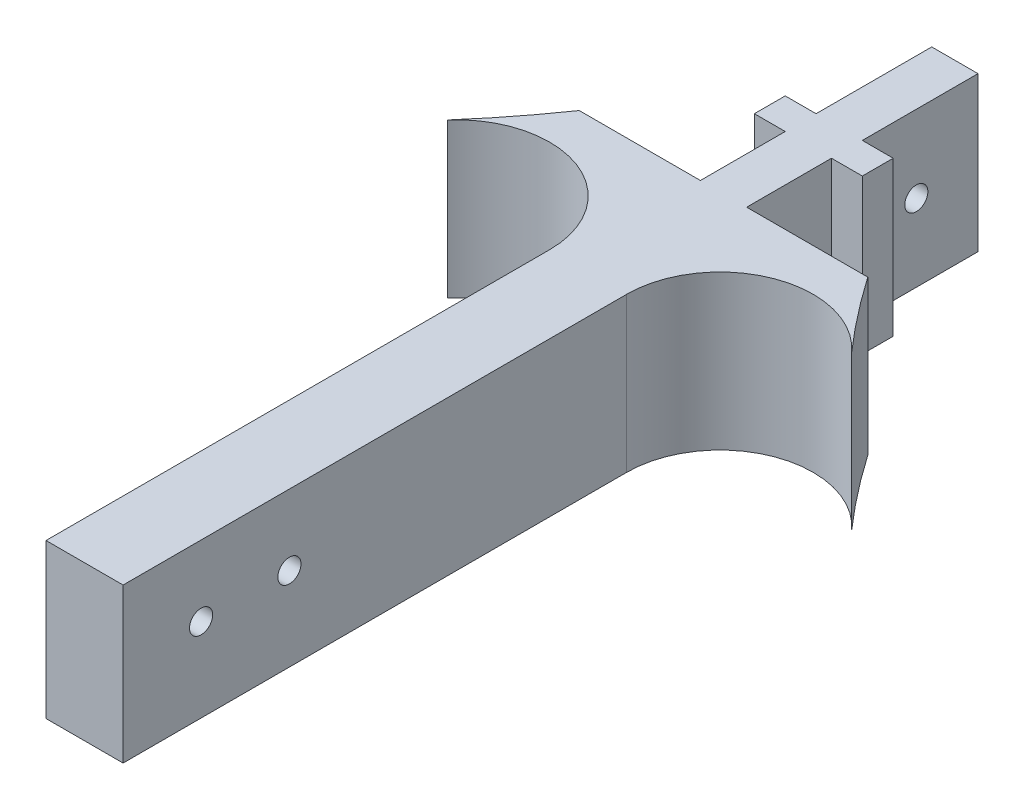
ISO-10303-21;
HEADER;
FILE_DESCRIPTION(('STEP AP214'),'2;1');
FILE_NAME('part.step','',(''),(''),'','','');
FILE_SCHEMA(('AUTOMOTIVE_DESIGN { 1 0 10303 214 1 1 1 1 }'));
ENDSEC;
DATA;
#1=APPLICATION_CONTEXT('core data for automotive mechanical design processes');
#2=APPLICATION_PROTOCOL_DEFINITION('international standard','automotive_design',2000,#1);
#3=PRODUCT_CONTEXT('',#1,'mechanical');
#4=PRODUCT('Part','Part','',(#3));
#5=PRODUCT_RELATED_PRODUCT_CATEGORY('part','',(#4));
#6=PRODUCT_DEFINITION_FORMATION('','',#4);
#7=PRODUCT_DEFINITION_CONTEXT('part definition',#1,'design');
#8=PRODUCT_DEFINITION('design','',#6,#7);
#9=PRODUCT_DEFINITION_SHAPE('','',#8);
#10=(LENGTH_UNIT() NAMED_UNIT(*) SI_UNIT(.MILLI.,.METRE.));
#11=(NAMED_UNIT(*) PLANE_ANGLE_UNIT() SI_UNIT($,.RADIAN.));
#12=(NAMED_UNIT(*) SI_UNIT($,.STERADIAN.) SOLID_ANGLE_UNIT());
#13=UNCERTAINTY_MEASURE_WITH_UNIT(LENGTH_MEASURE(1.E-05),#10,'distance_accuracy_value','');
#14=(GEOMETRIC_REPRESENTATION_CONTEXT(3) GLOBAL_UNCERTAINTY_ASSIGNED_CONTEXT((#13)) GLOBAL_UNIT_ASSIGNED_CONTEXT((#10,
#11,#12)) REPRESENTATION_CONTEXT('',''));
#15=CARTESIAN_POINT('',(0.,0.,0.));
#16=DIRECTION('',(0.,0.,1.));
#17=DIRECTION('',(1.,0.,0.));
#18=AXIS2_PLACEMENT_3D('',#15,#16,#17);
#19=CARTESIAN_POINT('',(-3.,20.,-84.398281038144));
#20=DIRECTION('',(0.,0.,1.));
#21=DIRECTION('',(1.,0.,0.));
#22=AXIS2_PLACEMENT_3D('',#19,#20,#21);
#23=PLANE('',#22);
#24=DIRECTION('',(-1.,0.,0.));
#25=VECTOR('',#24,1.);
#26=CARTESIAN_POINT('',(-3.,0.,-84.398281038144));
#27=LINE('',#26,#25);
#28=CARTESIAN_POINT('',(2.99999999999998,0.,-84.398281038144));
#29=VERTEX_POINT('',#28);
#30=CARTESIAN_POINT('',(-3.,0.,-84.398281038144));
#31=VERTEX_POINT('',#30);
#32=EDGE_CURVE('E148',#29,#31,#27,.T.);
#33=ORIENTED_EDGE('',*,*,#32,.T.);
#34=DIRECTION('',(0.,-1.,0.));
#35=VECTOR('',#34,1.);
#36=CARTESIAN_POINT('',(-3.,20.,-84.398281038144));
#37=LINE('',#36,#35);
#38=CARTESIAN_POINT('',(-3.,20.,-84.398281038144));
#39=VERTEX_POINT('',#38);
#40=EDGE_CURVE('E11',#39,#31,#37,.T.);
#41=ORIENTED_EDGE('',*,*,#40,.F.);
#42=DIRECTION('',(-1.,0.,0.));
#43=VECTOR('',#42,1.);
#44=CARTESIAN_POINT('',(-3.,20.,-84.398281038144));
#45=LINE('',#44,#43);
#46=CARTESIAN_POINT('',(2.99999999999998,20.,-84.398281038144));
#47=VERTEX_POINT('',#46);
#48=EDGE_CURVE('E170',#47,#39,#45,.T.);
#49=ORIENTED_EDGE('',*,*,#48,.F.);
#50=DIRECTION('',(0.,-1.,0.));
#51=VECTOR('',#50,1.);
#52=CARTESIAN_POINT('',(2.99999999999998,20.,-84.398281038144));
#53=LINE('',#52,#51);
#54=EDGE_CURVE('E232',#47,#29,#53,.T.);
#55=ORIENTED_EDGE('',*,*,#54,.T.);
#56=EDGE_LOOP('',(#33,#41,#49,#55));
#57=FACE_BOUND('',#56,.T.);
#58=ADVANCED_FACE('F31',(#57),#23,.F.);
#59=CARTESIAN_POINT('',(-3.,20.,-84.398281038144));
#60=DIRECTION('',(1.,0.,0.));
#61=DIRECTION('',(0.,0.,-1.));
#62=AXIS2_PLACEMENT_3D('',#59,#60,#61);
#63=PLANE('',#62);
#64=CARTESIAN_POINT('',(-3.,10.,-76.398281038144));
#65=DIRECTION('',(-1.,0.,0.));
#66=DIRECTION('',(0.,0.,1.));
#67=AXIS2_PLACEMENT_3D('',#64,#65,#66);
#68=CIRCLE('',#67,1.5);
#69=CARTESIAN_POINT('',(-3.,10.,-74.898281038144));
#70=VERTEX_POINT('',#69);
#71=EDGE_CURVE('E190',#70,#70,#68,.T.);
#72=ORIENTED_EDGE('',*,*,#71,.F.);
#73=EDGE_LOOP('',(#72));
#74=FACE_BOUND('',#73,.T.);
#75=DIRECTION('',(0.,0.,1.));
#76=VECTOR('',#75,1.);
#77=CARTESIAN_POINT('',(-3.,0.,-84.398281038144));
#78=LINE('',#77,#76);
#79=CARTESIAN_POINT('',(-3.,0.,-69.398281038144));
#80=VERTEX_POINT('',#79);
#81=EDGE_CURVE('E151',#31,#80,#78,.T.);
#82=ORIENTED_EDGE('',*,*,#81,.T.);
#83=DIRECTION('',(0.,-1.,0.));
#84=VECTOR('',#83,1.);
#85=CARTESIAN_POINT('',(-3.,20.,-69.398281038144));
#86=LINE('',#85,#84);
#87=CARTESIAN_POINT('',(-3.,20.,-69.398281038144));
#88=VERTEX_POINT('',#87);
#89=EDGE_CURVE('E40',#88,#80,#86,.T.);
#90=ORIENTED_EDGE('',*,*,#89,.F.);
#91=DIRECTION('',(0.,0.,1.));
#92=VECTOR('',#91,1.);
#93=CARTESIAN_POINT('',(-3.,20.,-84.398281038144));
#94=LINE('',#93,#92);
#95=EDGE_CURVE('E99',#39,#88,#94,.T.);
#96=ORIENTED_EDGE('',*,*,#95,.F.);
#97=ORIENTED_EDGE('',*,*,#40,.T.);
#98=EDGE_LOOP('',(#82,#90,#96,#97));
#99=FACE_BOUND('',#98,.T.);
#100=ADVANCED_FACE('F376',(#74,#99),#63,.F.);
#101=CARTESIAN_POINT('',(-3.,20.,-69.398281038144));
#102=DIRECTION('',(0.,0.,1.));
#103=DIRECTION('',(1.,0.,0.));
#104=AXIS2_PLACEMENT_3D('',#101,#102,#103);
#105=PLANE('',#104);
#106=DIRECTION('',(-1.,0.,0.));
#107=VECTOR('',#106,1.);
#108=CARTESIAN_POINT('',(-3.,0.,-69.398281038144));
#109=LINE('',#108,#107);
#110=CARTESIAN_POINT('',(-7.,0.,-69.398281038144));
#111=VERTEX_POINT('',#110);
#112=EDGE_CURVE('E154',#80,#111,#109,.T.);
#113=ORIENTED_EDGE('',*,*,#112,.T.);
#114=DIRECTION('',(0.,-1.,0.));
#115=VECTOR('',#114,1.);
#116=CARTESIAN_POINT('',(-7.,20.,-69.398281038144));
#117=LINE('',#116,#115);
#118=CARTESIAN_POINT('',(-7.,20.,-69.398281038144));
#119=VERTEX_POINT('',#118);
#120=EDGE_CURVE('E183',#119,#111,#117,.T.);
#121=ORIENTED_EDGE('',*,*,#120,.F.);
#122=DIRECTION('',(-1.,0.,0.));
#123=VECTOR('',#122,1.);
#124=CARTESIAN_POINT('',(-3.,20.,-69.398281038144));
#125=LINE('',#124,#123);
#126=EDGE_CURVE('E286',#88,#119,#125,.T.);
#127=ORIENTED_EDGE('',*,*,#126,.F.);
#128=ORIENTED_EDGE('',*,*,#89,.T.);
#129=EDGE_LOOP('',(#113,#121,#127,#128));
#130=FACE_BOUND('',#129,.T.);
#131=ADVANCED_FACE('F380',(#130),#105,.F.);
#132=CARTESIAN_POINT('',(-7.,20.,-69.398281038144));
#133=DIRECTION('',(1.,0.,0.));
#134=DIRECTION('',(0.,0.,-1.));
#135=AXIS2_PLACEMENT_3D('',#132,#133,#134);
#136=PLANE('',#135);
#137=DIRECTION('',(0.,0.,1.));
#138=VECTOR('',#137,1.);
#139=CARTESIAN_POINT('',(-7.,0.,-69.398281038144));
#140=LINE('',#139,#138);
#141=CARTESIAN_POINT('',(-7.,0.,-65.398281038144));
#142=VERTEX_POINT('',#141);
#143=EDGE_CURVE('E156',#111,#142,#140,.T.);
#144=ORIENTED_EDGE('',*,*,#143,.T.);
#145=DIRECTION('',(0.,-1.,0.));
#146=VECTOR('',#145,1.);
#147=CARTESIAN_POINT('',(-7.,20.,-65.398281038144));
#148=LINE('',#147,#146);
#149=CARTESIAN_POINT('',(-7.,20.,-65.398281038144));
#150=VERTEX_POINT('',#149);
#151=EDGE_CURVE('E180',#150,#142,#148,.T.);
#152=ORIENTED_EDGE('',*,*,#151,.F.);
#153=DIRECTION('',(0.,0.,1.));
#154=VECTOR('',#153,1.);
#155=CARTESIAN_POINT('',(-7.,20.,-69.398281038144));
#156=LINE('',#155,#154);
#157=EDGE_CURVE('E288',#119,#150,#156,.T.);
#158=ORIENTED_EDGE('',*,*,#157,.F.);
#159=ORIENTED_EDGE('',*,*,#120,.T.);
#160=EDGE_LOOP('',(#144,#152,#158,#159));
#161=FACE_BOUND('',#160,.T.);
#162=ADVANCED_FACE('F385',(#161),#136,.F.);
#163=CARTESIAN_POINT('',(-3.,20.,-65.398281038144));
#164=DIRECTION('',(0.,0.,-1.));
#165=DIRECTION('',(-1.,0.,0.));
#166=AXIS2_PLACEMENT_3D('',#163,#164,#165);
#167=PLANE('',#166);
#168=DIRECTION('',(1.,0.,0.));
#169=VECTOR('',#168,1.);
#170=CARTESIAN_POINT('',(-3.,0.,-65.398281038144));
#171=LINE('',#170,#169);
#172=CARTESIAN_POINT('',(-3.,0.,-65.398281038144));
#173=VERTEX_POINT('',#172);
#174=EDGE_CURVE('E158',#142,#173,#171,.T.);
#175=ORIENTED_EDGE('',*,*,#174,.T.);
#176=DIRECTION('',(0.,-1.,0.));
#177=VECTOR('',#176,1.);
#178=CARTESIAN_POINT('',(-3.,20.,-65.398281038144));
#179=LINE('',#178,#177);
#180=CARTESIAN_POINT('',(-3.,20.,-65.398281038144));
#181=VERTEX_POINT('',#180);
#182=EDGE_CURVE('E177',#181,#173,#179,.T.);
#183=ORIENTED_EDGE('',*,*,#182,.F.);
#184=DIRECTION('',(1.,0.,0.));
#185=VECTOR('',#184,1.);
#186=CARTESIAN_POINT('',(-3.,20.,-65.398281038144));
#187=LINE('',#186,#185);
#188=EDGE_CURVE('E290',#150,#181,#187,.T.);
#189=ORIENTED_EDGE('',*,*,#188,.F.);
#190=ORIENTED_EDGE('',*,*,#151,.T.);
#191=EDGE_LOOP('',(#175,#183,#189,#190));
#192=FACE_BOUND('',#191,.T.);
#193=ADVANCED_FACE('F391',(#192),#167,.F.);
#194=CARTESIAN_POINT('',(-3.,20.,-65.398281038144));
#195=DIRECTION('',(1.,0.,0.));
#196=DIRECTION('',(0.,0.,-1.));
#197=AXIS2_PLACEMENT_3D('',#194,#195,#196);
#198=PLANE('',#197);
#199=CARTESIAN_POINT('',(-3.,10.,-60.398281038144));
#200=DIRECTION('',(-1.,0.,0.));
#201=DIRECTION('',(0.,0.,1.));
#202=AXIS2_PLACEMENT_3D('',#199,#200,#201);
#203=CIRCLE('',#202,1.5);
#204=CARTESIAN_POINT('',(-3.,10.,-58.898281038144));
#205=VERTEX_POINT('',#204);
#206=EDGE_CURVE('E201',#205,#205,#203,.T.);
#207=ORIENTED_EDGE('',*,*,#206,.F.);
#208=EDGE_LOOP('',(#207));
#209=FACE_BOUND('',#208,.T.);
#210=DIRECTION('',(0.,0.,1.));
#211=VECTOR('',#210,1.);
#212=CARTESIAN_POINT('',(-3.,0.,-65.398281038144));
#213=LINE('',#212,#211);
#214=CARTESIAN_POINT('',(-3.,0.,-54.398281038144));
#215=VERTEX_POINT('',#214);
#216=EDGE_CURVE('E160',#173,#215,#213,.T.);
#217=ORIENTED_EDGE('',*,*,#216,.T.);
#218=DIRECTION('',(0.,-1.,0.));
#219=VECTOR('',#218,1.);
#220=CARTESIAN_POINT('',(-3.,20.,-54.398281038144));
#221=LINE('',#220,#219);
#222=CARTESIAN_POINT('',(-3.,20.,-54.398281038144));
#223=VERTEX_POINT('',#222);
#224=EDGE_CURVE('E174',#223,#215,#221,.T.);
#225=ORIENTED_EDGE('',*,*,#224,.F.);
#226=DIRECTION('',(0.,0.,1.));
#227=VECTOR('',#226,1.);
#228=CARTESIAN_POINT('',(-3.,20.,-65.398281038144));
#229=LINE('',#228,#227);
#230=EDGE_CURVE('E292',#181,#223,#229,.T.);
#231=ORIENTED_EDGE('',*,*,#230,.F.);
#232=ORIENTED_EDGE('',*,*,#182,.T.);
#233=EDGE_LOOP('',(#217,#225,#231,#232));
#234=FACE_BOUND('',#233,.T.);
#235=ADVANCED_FACE('F298',(#209,#234),#198,.F.);
#236=CARTESIAN_POINT('',(-3.,20.,-54.398281038144));
#237=DIRECTION('',(0.,0.,1.));
#238=DIRECTION('',(1.,0.,0.));
#239=AXIS2_PLACEMENT_3D('',#236,#237,#238);
#240=PLANE('',#239);
#241=DIRECTION('',(-1.,0.,0.));
#242=VECTOR('',#241,1.);
#243=CARTESIAN_POINT('',(-3.,0.,-54.398281038144));
#244=LINE('',#243,#242);
#245=CARTESIAN_POINT('',(-18.71,0.,-54.398281038144));
#246=VERTEX_POINT('',#245);
#247=EDGE_CURVE('E162',#215,#246,#244,.T.);
#248=ORIENTED_EDGE('',*,*,#247,.T.);
#249=DIRECTION('',(0.,-1.,0.));
#250=VECTOR('',#249,1.);
#251=CARTESIAN_POINT('',(-18.71,20.,-54.398281038144));
#252=LINE('',#251,#250);
#253=CARTESIAN_POINT('',(-18.71,20.,-54.398281038144));
#254=VERTEX_POINT('',#253);
#255=EDGE_CURVE('E137',#254,#246,#252,.T.);
#256=ORIENTED_EDGE('',*,*,#255,.F.);
#257=DIRECTION('',(-1.,0.,0.));
#258=VECTOR('',#257,1.);
#259=CARTESIAN_POINT('',(-3.,20.,-54.398281038144));
#260=LINE('',#259,#258);
#261=EDGE_CURVE('E128',#223,#254,#260,.T.);
#262=ORIENTED_EDGE('',*,*,#261,.F.);
#263=ORIENTED_EDGE('',*,*,#224,.T.);
#264=EDGE_LOOP('',(#248,#256,#262,#263));
#265=FACE_BOUND('',#264,.T.);
#266=ADVANCED_FACE('F302',(#265),#240,.F.);
#267=CARTESIAN_POINT('',(-105.5,20.,-114.379493930182));
#268=DIRECTION('',(0.,-1.,0.));
#269=DIRECTION('',(0.,0.,-1.));
#270=AXIS2_PLACEMENT_3D('',#267,#268,#269);
#271=CYLINDRICAL_SURFACE('',#270,105.5);
#272=CARTESIAN_POINT('',(-105.5,0.,-114.379493930182));
#273=DIRECTION('',(0.,-1.,0.));
#274=DIRECTION('',(0.,0.,1.));
#275=AXIS2_PLACEMENT_3D('',#272,#273,#274);
#276=CIRCLE('',#275,105.5);
#277=CARTESIAN_POINT('',(-26.1833299524756,0.,-44.8157400595625));
#278=VERTEX_POINT('',#277);
#279=EDGE_CURVE('E136',#246,#278,#276,.T.);
#280=ORIENTED_EDGE('',*,*,#279,.T.);
#281=DIRECTION('',(0.,-1.,0.));
#282=VECTOR('',#281,1.);
#283=CARTESIAN_POINT('',(-26.1833299524756,20.,-44.8157400595625));
#284=LINE('',#283,#282);
#285=CARTESIAN_POINT('',(-26.1833299524756,20.,-44.8157400595625));
#286=VERTEX_POINT('',#285);
#287=EDGE_CURVE('E133',#286,#278,#284,.T.);
#288=ORIENTED_EDGE('',*,*,#287,.F.);
#289=CARTESIAN_POINT('',(-105.5,20.,-114.379493930182));
#290=DIRECTION('',(0.,-1.,0.));
#291=DIRECTION('',(0.,0.,1.));
#292=AXIS2_PLACEMENT_3D('',#289,#290,#291);
#293=CIRCLE('',#292,105.5);
#294=EDGE_CURVE('E122',#254,#286,#293,.T.);
#295=ORIENTED_EDGE('',*,*,#294,.F.);
#296=ORIENTED_EDGE('',*,*,#255,.T.);
#297=EDGE_LOOP('',(#280,#288,#295,#296));
#298=FACE_BOUND('',#297,.T.);
#299=ADVANCED_FACE('F134',(#298),#271,.F.);
#300=CARTESIAN_POINT('',(-17.0922063437865,20.,-36.8424768761321));
#301=DIRECTION('',(0.,-1.,0.));
#302=DIRECTION('',(0.,0.,-1.));
#303=AXIS2_PLACEMENT_3D('',#300,#301,#302);
#304=CYLINDRICAL_SURFACE('',#303,12.0922063437865);
#305=CARTESIAN_POINT('',(-17.0922063437865,0.,-36.8424768761321));
#306=DIRECTION('',(0.,-1.,0.));
#307=DIRECTION('',(0.,0.,1.));
#308=AXIS2_PLACEMENT_3D('',#305,#306,#307);
#309=CIRCLE('',#308,12.0922063437865);
#310=CARTESIAN_POINT('',(-4.99999999999998,0.,-36.8424768761321));
#311=VERTEX_POINT('',#310);
#312=EDGE_CURVE('E85',#278,#311,#309,.T.);
#313=ORIENTED_EDGE('',*,*,#312,.T.);
#314=DIRECTION('',(0.,-1.,0.));
#315=VECTOR('',#314,1.);
#316=CARTESIAN_POINT('',(-4.99999999999998,20.,-36.8424768761321));
#317=LINE('',#316,#315);
#318=CARTESIAN_POINT('',(-4.99999999999998,20.,-36.8424768761321));
#319=VERTEX_POINT('',#318);
#320=EDGE_CURVE('E138',#319,#311,#317,.T.);
#321=ORIENTED_EDGE('',*,*,#320,.F.);
#322=CARTESIAN_POINT('',(-17.0922063437865,20.,-36.8424768761321));
#323=DIRECTION('',(0.,-1.,0.));
#324=DIRECTION('',(0.,0.,1.));
#325=AXIS2_PLACEMENT_3D('',#322,#323,#324);
#326=CIRCLE('',#325,12.0922063437865);
#327=EDGE_CURVE('E126',#286,#319,#326,.T.);
#328=ORIENTED_EDGE('',*,*,#327,.F.);
#329=ORIENTED_EDGE('',*,*,#287,.T.);
#330=EDGE_LOOP('',(#313,#321,#328,#329));
#331=FACE_BOUND('',#330,.T.);
#332=ADVANCED_FACE('F140',(#331),#304,.F.);
#333=CARTESIAN_POINT('',(-4.99999999999998,20.,-36.8424768761321));
#334=DIRECTION('',(1.,0.,0.));
#335=DIRECTION('',(0.,0.,-1.));
#336=AXIS2_PLACEMENT_3D('',#333,#334,#335);
#337=PLANE('',#336);
#338=CARTESIAN_POINT('',(-5.00000000000001,10.8445292972912,6.90246161721087));
#339=DIRECTION('',(1.,0.,0.));
#340=DIRECTION('',(0.,0.,-1.));
#341=AXIS2_PLACEMENT_3D('',#338,#339,#340);
#342=CIRCLE('',#341,1.5);
#343=CARTESIAN_POINT('',(-5.00000000000001,10.8445292972912,5.40246161721086));
#344=VERTEX_POINT('',#343);
#345=EDGE_CURVE('E552',#344,#344,#342,.T.);
#346=ORIENTED_EDGE('',*,*,#345,.T.);
#347=EDGE_LOOP('',(#346));
#348=FACE_BOUND('',#347,.T.);
#349=CARTESIAN_POINT('',(-5.,10.8445292972912,18.3543018526573));
#350=DIRECTION('',(1.,0.,0.));
#351=DIRECTION('',(0.,0.,-1.));
#352=AXIS2_PLACEMENT_3D('',#349,#350,#351);
#353=CIRCLE('',#352,1.4999999999998);
#354=CARTESIAN_POINT('',(-5.,10.8445292972912,16.8543018526575));
#355=VERTEX_POINT('',#354);
#356=EDGE_CURVE('E560',#355,#355,#353,.T.);
#357=ORIENTED_EDGE('',*,*,#356,.T.);
#358=EDGE_LOOP('',(#357));
#359=FACE_BOUND('',#358,.T.);
#360=DIRECTION('',(0.,0.,1.));
#361=VECTOR('',#360,1.);
#362=CARTESIAN_POINT('',(-4.99999999999998,0.,-36.8424768761321));
#363=LINE('',#362,#361);
#364=CARTESIAN_POINT('',(-4.99999999999999,0.,28.4678341268635));
#365=VERTEX_POINT('',#364);
#366=EDGE_CURVE('E91',#311,#365,#363,.T.);
#367=ORIENTED_EDGE('',*,*,#366,.T.);
#368=DIRECTION('',(0.,-1.,0.));
#369=VECTOR('',#368,1.);
#370=CARTESIAN_POINT('',(-4.99999999999999,20.,28.4678341268635));
#371=LINE('',#370,#369);
#372=CARTESIAN_POINT('',(-4.99999999999999,20.,28.4678341268635));
#373=VERTEX_POINT('',#372);
#374=EDGE_CURVE('E147',#373,#365,#371,.T.);
#375=ORIENTED_EDGE('',*,*,#374,.F.);
#376=DIRECTION('',(0.,0.,1.));
#377=VECTOR('',#376,1.);
#378=CARTESIAN_POINT('',(-4.99999999999998,20.,-36.8424768761321));
#379=LINE('',#378,#377);
#380=EDGE_CURVE('E49',#319,#373,#379,.T.);
#381=ORIENTED_EDGE('',*,*,#380,.F.);
#382=ORIENTED_EDGE('',*,*,#320,.T.);
#383=EDGE_LOOP('',(#367,#375,#381,#382));
#384=FACE_BOUND('',#383,.T.);
#385=ADVANCED_FACE('F405',(#348,#359,#384),#337,.F.);
#386=CARTESIAN_POINT('',(-4.99999999999999,20.,28.4678341268635));
#387=DIRECTION('',(0.,0.,-1.));
#388=DIRECTION('',(-1.,0.,0.));
#389=AXIS2_PLACEMENT_3D('',#386,#387,#388);
#390=PLANE('',#389);
#391=DIRECTION('',(1.,0.,0.));
#392=VECTOR('',#391,1.);
#393=CARTESIAN_POINT('',(-4.99999999999999,0.,28.4678341268635));
#394=LINE('',#393,#392);
#395=CARTESIAN_POINT('',(5.,0.,28.4678341268635));
#396=VERTEX_POINT('',#395);
#397=EDGE_CURVE('E167',#365,#396,#394,.T.);
#398=ORIENTED_EDGE('',*,*,#397,.T.);
#399=DIRECTION('',(0.,-1.,0.));
#400=VECTOR('',#399,1.);
#401=CARTESIAN_POINT('',(5.,20.,28.4678341268635));
#402=LINE('',#401,#400);
#403=CARTESIAN_POINT('',(5.,20.,28.4678341268635));
#404=VERTEX_POINT('',#403);
#405=EDGE_CURVE('E152',#404,#396,#402,.T.);
#406=ORIENTED_EDGE('',*,*,#405,.F.);
#407=DIRECTION('',(1.,0.,0.));
#408=VECTOR('',#407,1.);
#409=CARTESIAN_POINT('',(-4.99999999999999,20.,28.4678341268635));
#410=LINE('',#409,#408);
#411=EDGE_CURVE('E142',#373,#404,#410,.T.);
#412=ORIENTED_EDGE('',*,*,#411,.F.);
#413=ORIENTED_EDGE('',*,*,#374,.T.);
#414=EDGE_LOOP('',(#398,#406,#412,#413));
#415=FACE_BOUND('',#414,.T.);
#416=ADVANCED_FACE('F311',(#415),#390,.F.);
#417=CARTESIAN_POINT('',(-17.0922063437865,20.,-36.8424768761321));
#418=DIRECTION('',(0.,1.,0.));
#419=DIRECTION('',(0.,0.,1.));
#420=AXIS2_PLACEMENT_3D('',#417,#418,#419);
#421=PLANE('',#420);
#422=ORIENTED_EDGE('',*,*,#48,.T.);
#423=ORIENTED_EDGE('',*,*,#95,.T.);
#424=ORIENTED_EDGE('',*,*,#126,.T.);
#425=ORIENTED_EDGE('',*,*,#157,.T.);
#426=ORIENTED_EDGE('',*,*,#188,.T.);
#427=ORIENTED_EDGE('',*,*,#230,.T.);
#428=ORIENTED_EDGE('',*,*,#261,.T.);
#429=ORIENTED_EDGE('',*,*,#294,.T.);
#430=ORIENTED_EDGE('',*,*,#327,.T.);
#431=ORIENTED_EDGE('',*,*,#380,.T.);
#432=ORIENTED_EDGE('',*,*,#411,.T.);
#433=DIRECTION('',(0.,0.,1.));
#434=VECTOR('',#433,1.);
#435=CARTESIAN_POINT('',(4.99999999999997,20.,-36.8424768761321));
#436=LINE('',#435,#434);
#437=CARTESIAN_POINT('',(4.99999999999997,20.,-36.8424768761321));
#438=VERTEX_POINT('',#437);
#439=EDGE_CURVE('E205',#438,#404,#436,.T.);
#440=ORIENTED_EDGE('',*,*,#439,.F.);
#441=CARTESIAN_POINT('',(17.0922063437865,20.,-36.8424768761321));
#442=DIRECTION('',(0.,1.,0.));
#443=DIRECTION('',(0.,0.,1.));
#444=AXIS2_PLACEMENT_3D('',#441,#442,#443);
#445=CIRCLE('',#444,12.0922063437865);
#446=CARTESIAN_POINT('',(26.1833299524756,20.,-44.8157400595625));
#447=VERTEX_POINT('',#446);
#448=EDGE_CURVE('E208',#447,#438,#445,.T.);
#449=ORIENTED_EDGE('',*,*,#448,.F.);
#450=CARTESIAN_POINT('',(105.5,20.,-114.379493930182));
#451=DIRECTION('',(0.,1.,0.));
#452=DIRECTION('',(0.,0.,1.));
#453=AXIS2_PLACEMENT_3D('',#450,#451,#452);
#454=CIRCLE('',#453,105.5);
#455=CARTESIAN_POINT('',(18.71,20.,-54.398281038144));
#456=VERTEX_POINT('',#455);
#457=EDGE_CURVE('E212',#456,#447,#454,.T.);
#458=ORIENTED_EDGE('',*,*,#457,.F.);
#459=DIRECTION('',(1.,0.,0.));
#460=VECTOR('',#459,1.);
#461=CARTESIAN_POINT('',(2.99999999999998,20.,-54.398281038144));
#462=LINE('',#461,#460);
#463=CARTESIAN_POINT('',(2.99999999999998,20.,-54.398281038144));
#464=VERTEX_POINT('',#463);
#465=EDGE_CURVE('E215',#464,#456,#462,.T.);
#466=ORIENTED_EDGE('',*,*,#465,.F.);
#467=DIRECTION('',(0.,0.,1.));
#468=VECTOR('',#467,1.);
#469=CARTESIAN_POINT('',(2.99999999999998,20.,-65.398281038144));
#470=LINE('',#469,#468);
#471=CARTESIAN_POINT('',(2.99999999999998,20.,-65.398281038144));
#472=VERTEX_POINT('',#471);
#473=EDGE_CURVE('E218',#472,#464,#470,.T.);
#474=ORIENTED_EDGE('',*,*,#473,.F.);
#475=DIRECTION('',(-1.,0.,0.));
#476=VECTOR('',#475,1.);
#477=CARTESIAN_POINT('',(2.99999999999998,20.,-65.398281038144));
#478=LINE('',#477,#476);
#479=CARTESIAN_POINT('',(6.99999999999998,20.,-65.398281038144));
#480=VERTEX_POINT('',#479);
#481=EDGE_CURVE('E221',#480,#472,#478,.T.);
#482=ORIENTED_EDGE('',*,*,#481,.F.);
#483=DIRECTION('',(0.,0.,1.));
#484=VECTOR('',#483,1.);
#485=CARTESIAN_POINT('',(6.99999999999998,20.,-69.398281038144));
#486=LINE('',#485,#484);
#487=CARTESIAN_POINT('',(6.99999999999998,20.,-69.398281038144));
#488=VERTEX_POINT('',#487);
#489=EDGE_CURVE('E224',#488,#480,#486,.T.);
#490=ORIENTED_EDGE('',*,*,#489,.F.);
#491=DIRECTION('',(1.,0.,0.));
#492=VECTOR('',#491,1.);
#493=CARTESIAN_POINT('',(2.99999999999998,20.,-69.398281038144));
#494=LINE('',#493,#492);
#495=CARTESIAN_POINT('',(2.99999999999998,20.,-69.398281038144));
#496=VERTEX_POINT('',#495);
#497=EDGE_CURVE('E227',#496,#488,#494,.T.);
#498=ORIENTED_EDGE('',*,*,#497,.F.);
#499=DIRECTION('',(0.,0.,1.));
#500=VECTOR('',#499,1.);
#501=CARTESIAN_POINT('',(2.99999999999998,20.,-84.398281038144));
#502=LINE('',#501,#500);
#503=EDGE_CURVE('E230',#47,#496,#502,.T.);
#504=ORIENTED_EDGE('',*,*,#503,.F.);
#505=EDGE_LOOP('',(#422,#423,#424,#425,#426,#427,#428,#429,#430,#431,#432,#440,#449,#458,#466,
#474,#482,#490,#498,#504));
#506=FACE_BOUND('',#505,.T.);
#507=ADVANCED_FACE('F124',(#506),#421,.T.);
#508=CARTESIAN_POINT('',(-17.0922063437865,0.,-36.8424768761321));
#509=DIRECTION('',(0.,1.,0.));
#510=DIRECTION('',(0.,0.,1.));
#511=AXIS2_PLACEMENT_3D('',#508,#509,#510);
#512=PLANE('',#511);
#513=ORIENTED_EDGE('',*,*,#32,.F.);
#514=DIRECTION('',(0.,0.,1.));
#515=VECTOR('',#514,1.);
#516=CARTESIAN_POINT('',(2.99999999999998,0.,-84.398281038144));
#517=LINE('',#516,#515);
#518=CARTESIAN_POINT('',(2.99999999999998,0.,-69.398281038144));
#519=VERTEX_POINT('',#518);
#520=EDGE_CURVE('E209',#29,#519,#517,.T.);
#521=ORIENTED_EDGE('',*,*,#520,.T.);
#522=DIRECTION('',(1.,0.,0.));
#523=VECTOR('',#522,1.);
#524=CARTESIAN_POINT('',(2.99999999999998,0.,-69.398281038144));
#525=LINE('',#524,#523);
#526=CARTESIAN_POINT('',(6.99999999999998,0.,-69.398281038144));
#527=VERTEX_POINT('',#526);
#528=EDGE_CURVE('E251',#519,#527,#525,.T.);
#529=ORIENTED_EDGE('',*,*,#528,.T.);
#530=DIRECTION('',(0.,0.,1.));
#531=VECTOR('',#530,1.);
#532=CARTESIAN_POINT('',(6.99999999999998,0.,-69.398281038144));
#533=LINE('',#532,#531);
#534=CARTESIAN_POINT('',(6.99999999999998,0.,-65.398281038144));
#535=VERTEX_POINT('',#534);
#536=EDGE_CURVE('E248',#527,#535,#533,.T.);
#537=ORIENTED_EDGE('',*,*,#536,.T.);
#538=DIRECTION('',(-1.,0.,0.));
#539=VECTOR('',#538,1.);
#540=CARTESIAN_POINT('',(2.99999999999998,0.,-65.398281038144));
#541=LINE('',#540,#539);
#542=CARTESIAN_POINT('',(2.99999999999998,0.,-65.398281038144));
#543=VERTEX_POINT('',#542);
#544=EDGE_CURVE('E245',#535,#543,#541,.T.);
#545=ORIENTED_EDGE('',*,*,#544,.T.);
#546=DIRECTION('',(0.,0.,1.));
#547=VECTOR('',#546,1.);
#548=CARTESIAN_POINT('',(2.99999999999998,0.,-65.398281038144));
#549=LINE('',#548,#547);
#550=CARTESIAN_POINT('',(2.99999999999998,0.,-54.398281038144));
#551=VERTEX_POINT('',#550);
#552=EDGE_CURVE('E242',#543,#551,#549,.T.);
#553=ORIENTED_EDGE('',*,*,#552,.T.);
#554=DIRECTION('',(1.,0.,0.));
#555=VECTOR('',#554,1.);
#556=CARTESIAN_POINT('',(2.99999999999998,0.,-54.398281038144));
#557=LINE('',#556,#555);
#558=CARTESIAN_POINT('',(18.71,0.,-54.398281038144));
#559=VERTEX_POINT('',#558);
#560=EDGE_CURVE('E239',#551,#559,#557,.T.);
#561=ORIENTED_EDGE('',*,*,#560,.T.);
#562=CARTESIAN_POINT('',(105.5,0.,-114.379493930182));
#563=DIRECTION('',(0.,1.,0.));
#564=DIRECTION('',(0.,0.,1.));
#565=AXIS2_PLACEMENT_3D('',#562,#563,#564);
#566=CIRCLE('',#565,105.5);
#567=CARTESIAN_POINT('',(26.1833299524756,0.,-44.8157400595625));
#568=VERTEX_POINT('',#567);
#569=EDGE_CURVE('E236',#559,#568,#566,.T.);
#570=ORIENTED_EDGE('',*,*,#569,.T.);
#571=CARTESIAN_POINT('',(17.0922063437865,0.,-36.8424768761321));
#572=DIRECTION('',(0.,1.,0.));
#573=DIRECTION('',(0.,0.,1.));
#574=AXIS2_PLACEMENT_3D('',#571,#572,#573);
#575=CIRCLE('',#574,12.0922063437865);
#576=CARTESIAN_POINT('',(4.99999999999997,0.,-36.8424768761321));
#577=VERTEX_POINT('',#576);
#578=EDGE_CURVE('E194',#568,#577,#575,.T.);
#579=ORIENTED_EDGE('',*,*,#578,.T.);
#580=DIRECTION('',(0.,0.,1.));
#581=VECTOR('',#580,1.);
#582=CARTESIAN_POINT('',(4.99999999999997,0.,-36.8424768761321));
#583=LINE('',#582,#581);
#584=EDGE_CURVE('E189',#577,#396,#583,.T.);
#585=ORIENTED_EDGE('',*,*,#584,.T.);
#586=ORIENTED_EDGE('',*,*,#397,.F.);
#587=ORIENTED_EDGE('',*,*,#366,.F.);
#588=ORIENTED_EDGE('',*,*,#312,.F.);
#589=ORIENTED_EDGE('',*,*,#279,.F.);
#590=ORIENTED_EDGE('',*,*,#247,.F.);
#591=ORIENTED_EDGE('',*,*,#216,.F.);
#592=ORIENTED_EDGE('',*,*,#174,.F.);
#593=ORIENTED_EDGE('',*,*,#143,.F.);
#594=ORIENTED_EDGE('',*,*,#112,.F.);
#595=ORIENTED_EDGE('',*,*,#81,.F.);
#596=EDGE_LOOP('',(#513,#521,#529,#537,#545,#553,#561,#570,#579,#585,#586,#587,#588,#589,#590,
#591,#592,#593,#594,#595));
#597=FACE_BOUND('',#596,.T.);
#598=ADVANCED_FACE('F305',(#597),#512,.F.);
#599=CARTESIAN_POINT('',(4.99999999999997,20.,-36.8424768761321));
#600=DIRECTION('',(1.,0.,0.));
#601=DIRECTION('',(0.,0.,-1.));
#602=AXIS2_PLACEMENT_3D('',#599,#600,#601);
#603=PLANE('',#602);
#604=CARTESIAN_POINT('',(4.99999999999999,10.8445292972912,6.90246161721086));
#605=DIRECTION('',(1.,0.,0.));
#606=DIRECTION('',(0.,0.,-1.));
#607=AXIS2_PLACEMENT_3D('',#604,#605,#606);
#608=CIRCLE('',#607,1.5);
#609=CARTESIAN_POINT('',(4.99999999999999,10.8445292972912,5.40246161721086));
#610=VERTEX_POINT('',#609);
#611=EDGE_CURVE('E555',#610,#610,#608,.T.);
#612=ORIENTED_EDGE('',*,*,#611,.F.);
#613=EDGE_LOOP('',(#612));
#614=FACE_BOUND('',#613,.T.);
#615=CARTESIAN_POINT('',(5.,10.8445292972912,18.3543018526573));
#616=DIRECTION('',(1.,0.,0.));
#617=DIRECTION('',(0.,0.,-1.));
#618=AXIS2_PLACEMENT_3D('',#615,#616,#617);
#619=CIRCLE('',#618,1.4999999999998);
#620=CARTESIAN_POINT('',(5.,10.8445292972912,16.8543018526575));
#621=VERTEX_POINT('',#620);
#622=EDGE_CURVE('E557',#621,#621,#619,.T.);
#623=ORIENTED_EDGE('',*,*,#622,.F.);
#624=EDGE_LOOP('',(#623));
#625=FACE_BOUND('',#624,.T.);
#626=ORIENTED_EDGE('',*,*,#584,.F.);
#627=DIRECTION('',(0.,-1.,0.));
#628=VECTOR('',#627,1.);
#629=CARTESIAN_POINT('',(4.99999999999997,20.,-36.8424768761321));
#630=LINE('',#629,#628);
#631=EDGE_CURVE('E279',#438,#577,#630,.T.);
#632=ORIENTED_EDGE('',*,*,#631,.F.);
#633=ORIENTED_EDGE('',*,*,#439,.T.);
#634=ORIENTED_EDGE('',*,*,#405,.T.);
#635=EDGE_LOOP('',(#626,#632,#633,#634));
#636=FACE_BOUND('',#635,.T.);
#637=ADVANCED_FACE('F317',(#614,#625,#636),#603,.T.);
#638=CARTESIAN_POINT('',(17.0922063437865,20.,-36.8424768761321));
#639=DIRECTION('',(0.,-1.,0.));
#640=DIRECTION('',(0.,0.,-1.));
#641=AXIS2_PLACEMENT_3D('',#638,#639,#640);
#642=CYLINDRICAL_SURFACE('',#641,12.0922063437865);
#643=ORIENTED_EDGE('',*,*,#578,.F.);
#644=DIRECTION('',(0.,-1.,0.));
#645=VECTOR('',#644,1.);
#646=CARTESIAN_POINT('',(26.1833299524756,20.,-44.8157400595625));
#647=LINE('',#646,#645);
#648=EDGE_CURVE('E276',#447,#568,#647,.T.);
#649=ORIENTED_EDGE('',*,*,#648,.F.);
#650=ORIENTED_EDGE('',*,*,#448,.T.);
#651=ORIENTED_EDGE('',*,*,#631,.T.);
#652=EDGE_LOOP('',(#643,#649,#650,#651));
#653=FACE_BOUND('',#652,.T.);
#654=ADVANCED_FACE('F329',(#653),#642,.F.);
#655=CARTESIAN_POINT('',(105.5,20.,-114.379493930182));
#656=DIRECTION('',(0.,-1.,0.));
#657=DIRECTION('',(0.,0.,-1.));
#658=AXIS2_PLACEMENT_3D('',#655,#656,#657);
#659=CYLINDRICAL_SURFACE('',#658,105.5);
#660=ORIENTED_EDGE('',*,*,#569,.F.);
#661=DIRECTION('',(0.,-1.,0.));
#662=VECTOR('',#661,1.);
#663=CARTESIAN_POINT('',(18.71,20.,-54.398281038144));
#664=LINE('',#663,#662);
#665=EDGE_CURVE('E273',#456,#559,#664,.T.);
#666=ORIENTED_EDGE('',*,*,#665,.F.);
#667=ORIENTED_EDGE('',*,*,#457,.T.);
#668=ORIENTED_EDGE('',*,*,#648,.T.);
#669=EDGE_LOOP('',(#660,#666,#667,#668));
#670=FACE_BOUND('',#669,.T.);
#671=ADVANCED_FACE('F335',(#670),#659,.F.);
#672=CARTESIAN_POINT('',(2.99999999999998,20.,-54.398281038144));
#673=DIRECTION('',(0.,0.,-1.));
#674=DIRECTION('',(-1.,0.,0.));
#675=AXIS2_PLACEMENT_3D('',#672,#673,#674);
#676=PLANE('',#675);
#677=ORIENTED_EDGE('',*,*,#560,.F.);
#678=DIRECTION('',(0.,-1.,0.));
#679=VECTOR('',#678,1.);
#680=CARTESIAN_POINT('',(2.99999999999998,20.,-54.398281038144));
#681=LINE('',#680,#679);
#682=EDGE_CURVE('E270',#464,#551,#681,.T.);
#683=ORIENTED_EDGE('',*,*,#682,.F.);
#684=ORIENTED_EDGE('',*,*,#465,.T.);
#685=ORIENTED_EDGE('',*,*,#665,.T.);
#686=EDGE_LOOP('',(#677,#683,#684,#685));
#687=FACE_BOUND('',#686,.T.);
#688=ADVANCED_FACE('F422',(#687),#676,.T.);
#689=CARTESIAN_POINT('',(2.99999999999998,20.,-65.398281038144));
#690=DIRECTION('',(1.,0.,0.));
#691=DIRECTION('',(0.,0.,-1.));
#692=AXIS2_PLACEMENT_3D('',#689,#690,#691);
#693=PLANE('',#692);
#694=CARTESIAN_POINT('',(2.99999999999998,10.,-60.398281038144));
#695=DIRECTION('',(1.,0.,0.));
#696=DIRECTION('',(0.,0.,-1.));
#697=AXIS2_PLACEMENT_3D('',#694,#695,#696);
#698=CIRCLE('',#697,1.5);
#699=CARTESIAN_POINT('',(2.99999999999998,10.,-61.898281038144));
#700=VERTEX_POINT('',#699);
#701=EDGE_CURVE('E34',#700,#700,#698,.T.);
#702=ORIENTED_EDGE('',*,*,#701,.F.);
#703=EDGE_LOOP('',(#702));
#704=FACE_BOUND('',#703,.T.);
#705=ORIENTED_EDGE('',*,*,#552,.F.);
#706=DIRECTION('',(0.,-1.,0.));
#707=VECTOR('',#706,1.);
#708=CARTESIAN_POINT('',(2.99999999999998,20.,-65.398281038144));
#709=LINE('',#708,#707);
#710=EDGE_CURVE('E267',#472,#543,#709,.T.);
#711=ORIENTED_EDGE('',*,*,#710,.F.);
#712=ORIENTED_EDGE('',*,*,#473,.T.);
#713=ORIENTED_EDGE('',*,*,#682,.T.);
#714=EDGE_LOOP('',(#705,#711,#712,#713));
#715=FACE_BOUND('',#714,.T.);
#716=ADVANCED_FACE('F425',(#704,#715),#693,.T.);
#717=CARTESIAN_POINT('',(2.99999999999998,20.,-65.398281038144));
#718=DIRECTION('',(0.,0.,1.));
#719=DIRECTION('',(1.,0.,0.));
#720=AXIS2_PLACEMENT_3D('',#717,#718,#719);
#721=PLANE('',#720);
#722=ORIENTED_EDGE('',*,*,#544,.F.);
#723=DIRECTION('',(0.,-1.,0.));
#724=VECTOR('',#723,1.);
#725=CARTESIAN_POINT('',(6.99999999999998,20.,-65.398281038144));
#726=LINE('',#725,#724);
#727=EDGE_CURVE('E264',#480,#535,#726,.T.);
#728=ORIENTED_EDGE('',*,*,#727,.F.);
#729=ORIENTED_EDGE('',*,*,#481,.T.);
#730=ORIENTED_EDGE('',*,*,#710,.T.);
#731=EDGE_LOOP('',(#722,#728,#729,#730));
#732=FACE_BOUND('',#731,.T.);
#733=ADVANCED_FACE('F429',(#732),#721,.T.);
#734=CARTESIAN_POINT('',(6.99999999999998,20.,-69.398281038144));
#735=DIRECTION('',(1.,0.,0.));
#736=DIRECTION('',(0.,0.,-1.));
#737=AXIS2_PLACEMENT_3D('',#734,#735,#736);
#738=PLANE('',#737);
#739=ORIENTED_EDGE('',*,*,#536,.F.);
#740=DIRECTION('',(0.,-1.,0.));
#741=VECTOR('',#740,1.);
#742=CARTESIAN_POINT('',(6.99999999999998,20.,-69.398281038144));
#743=LINE('',#742,#741);
#744=EDGE_CURVE('E261',#488,#527,#743,.T.);
#745=ORIENTED_EDGE('',*,*,#744,.F.);
#746=ORIENTED_EDGE('',*,*,#489,.T.);
#747=ORIENTED_EDGE('',*,*,#727,.T.);
#748=EDGE_LOOP('',(#739,#745,#746,#747));
#749=FACE_BOUND('',#748,.T.);
#750=ADVANCED_FACE('F372',(#749),#738,.T.);
#751=CARTESIAN_POINT('',(2.99999999999998,20.,-69.398281038144));
#752=DIRECTION('',(0.,0.,-1.));
#753=DIRECTION('',(-1.,0.,0.));
#754=AXIS2_PLACEMENT_3D('',#751,#752,#753);
#755=PLANE('',#754);
#756=ORIENTED_EDGE('',*,*,#528,.F.);
#757=DIRECTION('',(0.,-1.,0.));
#758=VECTOR('',#757,1.);
#759=CARTESIAN_POINT('',(2.99999999999998,20.,-69.398281038144));
#760=LINE('',#759,#758);
#761=EDGE_CURVE('E258',#496,#519,#760,.T.);
#762=ORIENTED_EDGE('',*,*,#761,.F.);
#763=ORIENTED_EDGE('',*,*,#497,.T.);
#764=ORIENTED_EDGE('',*,*,#744,.T.);
#765=EDGE_LOOP('',(#756,#762,#763,#764));
#766=FACE_BOUND('',#765,.T.);
#767=ADVANCED_FACE('F363',(#766),#755,.T.);
#768=CARTESIAN_POINT('',(2.99999999999998,20.,-84.398281038144));
#769=DIRECTION('',(1.,0.,0.));
#770=DIRECTION('',(0.,0.,-1.));
#771=AXIS2_PLACEMENT_3D('',#768,#769,#770);
#772=PLANE('',#771);
#773=CARTESIAN_POINT('',(2.99999999999998,10.,-76.398281038144));
#774=DIRECTION('',(1.,0.,0.));
#775=DIRECTION('',(0.,0.,-1.));
#776=AXIS2_PLACEMENT_3D('',#773,#774,#775);
#777=CIRCLE('',#776,1.5);
#778=CARTESIAN_POINT('',(2.99999999999998,10.,-77.898281038144));
#779=VERTEX_POINT('',#778);
#780=EDGE_CURVE('E187',#779,#779,#777,.T.);
#781=ORIENTED_EDGE('',*,*,#780,.F.);
#782=EDGE_LOOP('',(#781));
#783=FACE_BOUND('',#782,.T.);
#784=ORIENTED_EDGE('',*,*,#520,.F.);
#785=ORIENTED_EDGE('',*,*,#54,.F.);
#786=ORIENTED_EDGE('',*,*,#503,.T.);
#787=ORIENTED_EDGE('',*,*,#761,.T.);
#788=EDGE_LOOP('',(#784,#785,#786,#787));
#789=FACE_BOUND('',#788,.T.);
#790=ADVANCED_FACE('F360',(#783,#789),#772,.T.);
#791=CARTESIAN_POINT('',(17.,10.,-76.398281038144));
#792=DIRECTION('',(-1.,0.,0.));
#793=DIRECTION('',(0.,0.,1.));
#794=AXIS2_PLACEMENT_3D('',#791,#792,#793);
#795=CYLINDRICAL_SURFACE('',#794,1.5);
#796=ORIENTED_EDGE('',*,*,#780,.T.);
#797=EDGE_LOOP('',(#796));
#798=FACE_BOUND('',#797,.T.);
#799=ORIENTED_EDGE('',*,*,#71,.T.);
#800=EDGE_LOOP('',(#799));
#801=FACE_BOUND('',#800,.T.);
#802=ADVANCED_FACE('F362',(#798,#801),#795,.F.);
#803=CARTESIAN_POINT('',(17.,10.,-60.398281038144));
#804=DIRECTION('',(-1.,0.,0.));
#805=DIRECTION('',(0.,0.,1.));
#806=AXIS2_PLACEMENT_3D('',#803,#804,#805);
#807=CYLINDRICAL_SURFACE('',#806,1.5);
#808=ORIENTED_EDGE('',*,*,#701,.T.);
#809=EDGE_LOOP('',(#808));
#810=FACE_BOUND('',#809,.T.);
#811=ORIENTED_EDGE('',*,*,#206,.T.);
#812=EDGE_LOOP('',(#811));
#813=FACE_BOUND('',#812,.T.);
#814=ADVANCED_FACE('F370',(#810,#813),#807,.F.);
#815=CARTESIAN_POINT('',(-5.,10.8445292972912,18.3543018526573));
#816=DIRECTION('',(1.,0.,0.));
#817=DIRECTION('',(0.,0.,-1.));
#818=AXIS2_PLACEMENT_3D('',#815,#816,#817);
#819=CYLINDRICAL_SURFACE('',#818,1.4999999999998);
#820=ORIENTED_EDGE('',*,*,#356,.F.);
#821=EDGE_LOOP('',(#820));
#822=FACE_BOUND('',#821,.T.);
#823=ORIENTED_EDGE('',*,*,#622,.T.);
#824=EDGE_LOOP('',(#823));
#825=FACE_BOUND('',#824,.T.);
#826=ADVANCED_FACE('F517',(#822,#825),#819,.F.);
#827=CARTESIAN_POINT('',(-5.00000000000001,10.8445292972912,6.90246161721087));
#828=DIRECTION('',(1.,0.,0.));
#829=DIRECTION('',(0.,0.,-1.));
#830=AXIS2_PLACEMENT_3D('',#827,#828,#829);
#831=CYLINDRICAL_SURFACE('',#830,1.5);
#832=ORIENTED_EDGE('',*,*,#345,.F.);
#833=EDGE_LOOP('',(#832));
#834=FACE_BOUND('',#833,.T.);
#835=ORIENTED_EDGE('',*,*,#611,.T.);
#836=EDGE_LOOP('',(#835));
#837=FACE_BOUND('',#836,.T.);
#838=ADVANCED_FACE('F526',(#834,#837),#831,.F.);
#839=CLOSED_SHELL('',(#58,#100,#131,#162,#193,#235,#266,#299,#332,#385,#416,#507,#598,#637,#654,
#671,#688,#716,#733,#750,#767,#790,#802,#814,#826,#838));
#840=MANIFOLD_SOLID_BREP('B2',#839);
#841=ADVANCED_BREP_SHAPE_REPRESENTATION('',(#18,#840),#14);
#842=SHAPE_DEFINITION_REPRESENTATION(#9,#841);
ENDSEC;
END-ISO-10303-21;
